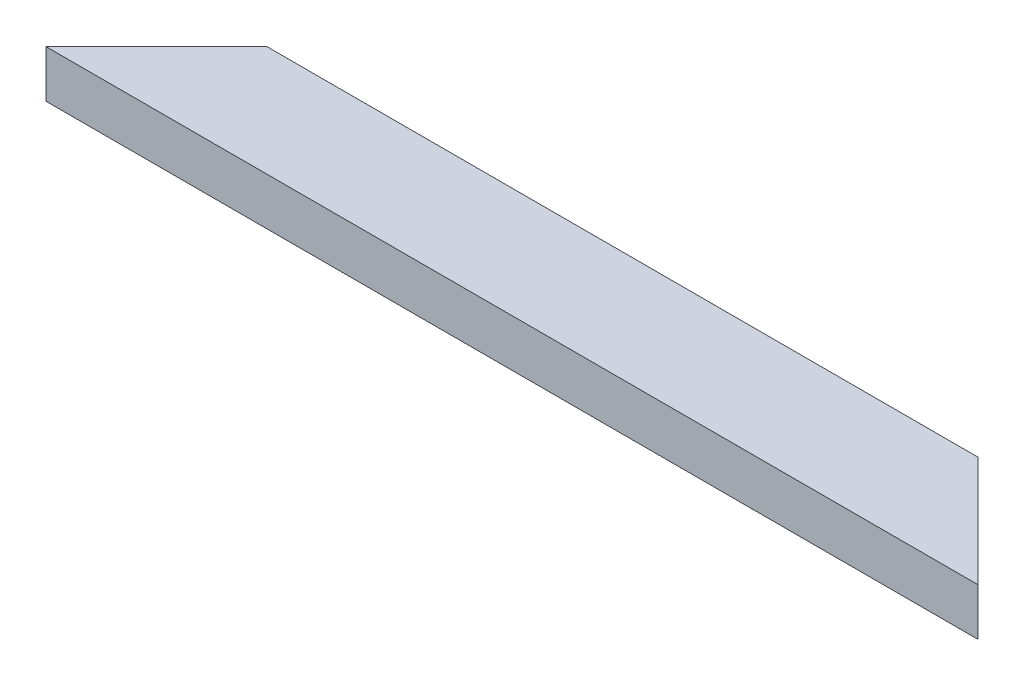
ISO-10303-21;
HEADER;
FILE_DESCRIPTION(('STEP AP214'),'2;1');
FILE_NAME('part.step','',(''),(''),'','','');
FILE_SCHEMA(('AUTOMOTIVE_DESIGN { 1 0 10303 214 1 1 1 1 }'));
ENDSEC;
DATA;
#1=APPLICATION_CONTEXT('core data for automotive mechanical design processes');
#2=APPLICATION_PROTOCOL_DEFINITION('international standard','automotive_design',2000,#1);
#3=PRODUCT_CONTEXT('',#1,'mechanical');
#4=PRODUCT('Part','Part','',(#3));
#5=PRODUCT_RELATED_PRODUCT_CATEGORY('part','',(#4));
#6=PRODUCT_DEFINITION_FORMATION('','',#4);
#7=PRODUCT_DEFINITION_CONTEXT('part definition',#1,'design');
#8=PRODUCT_DEFINITION('design','',#6,#7);
#9=PRODUCT_DEFINITION_SHAPE('','',#8);
#10=(LENGTH_UNIT() NAMED_UNIT(*) SI_UNIT(.MILLI.,.METRE.));
#11=(NAMED_UNIT(*) PLANE_ANGLE_UNIT() SI_UNIT($,.RADIAN.));
#12=(NAMED_UNIT(*) SI_UNIT($,.STERADIAN.) SOLID_ANGLE_UNIT());
#13=UNCERTAINTY_MEASURE_WITH_UNIT(LENGTH_MEASURE(1.E-05),#10,'distance_accuracy_value','');
#14=(GEOMETRIC_REPRESENTATION_CONTEXT(3) GLOBAL_UNCERTAINTY_ASSIGNED_CONTEXT((#13)) GLOBAL_UNIT_ASSIGNED_CONTEXT((#10,
#11,#12)) REPRESENTATION_CONTEXT('',''));
#15=CARTESIAN_POINT('',(0.,0.,0.));
#16=DIRECTION('',(0.,0.,1.));
#17=DIRECTION('',(1.,0.,0.));
#18=AXIS2_PLACEMENT_3D('',#15,#16,#17);
#19=CARTESIAN_POINT('',(88.8999999999999,38.1,-88.8999999999999));
#20=DIRECTION('',(0.707106781186547,0.,0.707106781186547));
#21=DIRECTION('',(0.707106781186548,0.,-0.707106781186548));
#22=AXIS2_PLACEMENT_3D('',#19,#20,#21);
#23=PLANE('',#22);
#24=DIRECTION('',(-0.707106781186547,0.,0.707106781186547));
#25=VECTOR('',#24,1.);
#26=CARTESIAN_POINT('',(88.8999999999999,0.,-88.8999999999999));
#27=LINE('',#26,#25);
#28=CARTESIAN_POINT('',(88.8999999999999,0.,-88.8999999999999));
#29=VERTEX_POINT('',#28);
#30=CARTESIAN_POINT('',(0.,0.,0.));
#31=VERTEX_POINT('',#30);
#32=EDGE_CURVE('E107',#29,#31,#27,.T.);
#33=ORIENTED_EDGE('',*,*,#32,.T.);
#34=DIRECTION('',(0.,-1.,0.));
#35=VECTOR('',#34,1.);
#36=CARTESIAN_POINT('',(0.,38.1,0.));
#37=LINE('',#36,#35);
#38=CARTESIAN_POINT('',(0.,38.1,0.));
#39=VERTEX_POINT('',#38);
#40=EDGE_CURVE('E11',#39,#31,#37,.T.);
#41=ORIENTED_EDGE('',*,*,#40,.F.);
#42=DIRECTION('',(-0.707106781186547,0.,0.707106781186547));
#43=VECTOR('',#42,1.);
#44=CARTESIAN_POINT('',(88.8999999999999,38.1,-88.8999999999999));
#45=LINE('',#44,#43);
#46=CARTESIAN_POINT('',(88.8999999999999,38.1,-88.8999999999999));
#47=VERTEX_POINT('',#46);
#48=EDGE_CURVE('E91',#47,#39,#45,.T.);
#49=ORIENTED_EDGE('',*,*,#48,.F.);
#50=DIRECTION('',(0.,-1.,0.));
#51=VECTOR('',#50,1.);
#52=CARTESIAN_POINT('',(88.8999999999999,38.1,-88.8999999999999));
#53=LINE('',#52,#51);
#54=EDGE_CURVE('E103',#47,#29,#53,.T.);
#55=ORIENTED_EDGE('',*,*,#54,.T.);
#56=EDGE_LOOP('',(#33,#41,#49,#55));
#57=FACE_BOUND('',#56,.T.);
#58=ADVANCED_FACE('F39',(#57),#23,.F.);
#59=CARTESIAN_POINT('',(0.,38.1,0.));
#60=DIRECTION('',(0.,0.,-1.));
#61=DIRECTION('',(-1.,0.,0.));
#62=AXIS2_PLACEMENT_3D('',#59,#60,#61);
#63=PLANE('',#62);
#64=DIRECTION('',(1.,0.,0.));
#65=VECTOR('',#64,1.);
#66=CARTESIAN_POINT('',(0.,0.,0.));
#67=LINE('',#66,#65);
#68=CARTESIAN_POINT('',(750.,0.,0.));
#69=VERTEX_POINT('',#68);
#70=EDGE_CURVE('E96',#31,#69,#67,.T.);
#71=ORIENTED_EDGE('',*,*,#70,.T.);
#72=DIRECTION('',(0.,-1.,0.));
#73=VECTOR('',#72,1.);
#74=CARTESIAN_POINT('',(750.,38.1,0.));
#75=LINE('',#74,#73);
#76=CARTESIAN_POINT('',(750.,38.1,0.));
#77=VERTEX_POINT('',#76);
#78=EDGE_CURVE('E48',#77,#69,#75,.T.);
#79=ORIENTED_EDGE('',*,*,#78,.F.);
#80=DIRECTION('',(1.,0.,0.));
#81=VECTOR('',#80,1.);
#82=CARTESIAN_POINT('',(0.,38.1,0.));
#83=LINE('',#82,#81);
#84=EDGE_CURVE('E86',#39,#77,#83,.T.);
#85=ORIENTED_EDGE('',*,*,#84,.F.);
#86=ORIENTED_EDGE('',*,*,#40,.T.);
#87=EDGE_LOOP('',(#71,#79,#85,#86));
#88=FACE_BOUND('',#87,.T.);
#89=ADVANCED_FACE('F95',(#88),#63,.F.);
#90=CARTESIAN_POINT('',(750.,38.1,0.));
#91=DIRECTION('',(-0.707106781186547,0.,0.707106781186548));
#92=DIRECTION('',(0.707106781186548,0.,0.707106781186547));
#93=AXIS2_PLACEMENT_3D('',#90,#91,#92);
#94=PLANE('',#93);
#95=DIRECTION('',(-0.707106781186548,0.,-0.707106781186547));
#96=VECTOR('',#95,1.);
#97=CARTESIAN_POINT('',(750.,0.,0.));
#98=LINE('',#97,#96);
#99=CARTESIAN_POINT('',(661.1,0.,-88.8999999999999));
#100=VERTEX_POINT('',#99);
#101=EDGE_CURVE('E73',#69,#100,#98,.T.);
#102=ORIENTED_EDGE('',*,*,#101,.T.);
#103=DIRECTION('',(0.,-1.,0.));
#104=VECTOR('',#103,1.);
#105=CARTESIAN_POINT('',(661.1,38.1,-88.8999999999999));
#106=LINE('',#105,#104);
#107=CARTESIAN_POINT('',(661.1,38.1,-88.8999999999999));
#108=VERTEX_POINT('',#107);
#109=EDGE_CURVE('E98',#108,#100,#106,.T.);
#110=ORIENTED_EDGE('',*,*,#109,.F.);
#111=DIRECTION('',(-0.707106781186548,0.,-0.707106781186547));
#112=VECTOR('',#111,1.);
#113=CARTESIAN_POINT('',(750.,38.1,0.));
#114=LINE('',#113,#112);
#115=EDGE_CURVE('E89',#77,#108,#114,.T.);
#116=ORIENTED_EDGE('',*,*,#115,.F.);
#117=ORIENTED_EDGE('',*,*,#78,.T.);
#118=EDGE_LOOP('',(#102,#110,#116,#117));
#119=FACE_BOUND('',#118,.T.);
#120=ADVANCED_FACE('F99',(#119),#94,.F.);
#121=CARTESIAN_POINT('',(661.1,38.1,-88.8999999999999));
#122=DIRECTION('',(0.,0.,1.));
#123=DIRECTION('',(1.,0.,0.));
#124=AXIS2_PLACEMENT_3D('',#121,#122,#123);
#125=PLANE('',#124);
#126=DIRECTION('',(-1.,0.,0.));
#127=VECTOR('',#126,1.);
#128=CARTESIAN_POINT('',(661.1,0.,-88.8999999999999));
#129=LINE('',#128,#127);
#130=EDGE_CURVE('E79',#100,#29,#129,.T.);
#131=ORIENTED_EDGE('',*,*,#130,.T.);
#132=ORIENTED_EDGE('',*,*,#54,.F.);
#133=DIRECTION('',(-1.,0.,0.));
#134=VECTOR('',#133,1.);
#135=CARTESIAN_POINT('',(661.1,38.1,-88.8999999999999));
#136=LINE('',#135,#134);
#137=EDGE_CURVE('E56',#108,#47,#136,.T.);
#138=ORIENTED_EDGE('',*,*,#137,.F.);
#139=ORIENTED_EDGE('',*,*,#109,.T.);
#140=EDGE_LOOP('',(#131,#132,#138,#139));
#141=FACE_BOUND('',#140,.T.);
#142=ADVANCED_FACE('F120',(#141),#125,.F.);
#143=CARTESIAN_POINT('',(0.,38.1,0.));
#144=DIRECTION('',(0.,-1.,0.));
#145=DIRECTION('',(0.,0.,-1.));
#146=AXIS2_PLACEMENT_3D('',#143,#144,#145);
#147=PLANE('',#146);
#148=ORIENTED_EDGE('',*,*,#48,.T.);
#149=ORIENTED_EDGE('',*,*,#84,.T.);
#150=ORIENTED_EDGE('',*,*,#115,.T.);
#151=ORIENTED_EDGE('',*,*,#137,.T.);
#152=EDGE_LOOP('',(#148,#149,#150,#151));
#153=FACE_BOUND('',#152,.T.);
#154=ADVANCED_FACE('F87',(#153),#147,.F.);
#155=CARTESIAN_POINT('',(0.,0.,0.));
#156=DIRECTION('',(0.,-1.,0.));
#157=DIRECTION('',(0.,0.,-1.));
#158=AXIS2_PLACEMENT_3D('',#155,#156,#157);
#159=PLANE('',#158);
#160=ORIENTED_EDGE('',*,*,#32,.F.);
#161=ORIENTED_EDGE('',*,*,#130,.F.);
#162=ORIENTED_EDGE('',*,*,#101,.F.);
#163=ORIENTED_EDGE('',*,*,#70,.F.);
#164=EDGE_LOOP('',(#160,#161,#162,#163));
#165=FACE_BOUND('',#164,.T.);
#166=ADVANCED_FACE('F123',(#165),#159,.T.);
#167=CLOSED_SHELL('',(#58,#89,#120,#142,#154,#166));
#168=MANIFOLD_SOLID_BREP('B2',#167);
#169=ADVANCED_BREP_SHAPE_REPRESENTATION('',(#18,#168),#14);
#170=SHAPE_DEFINITION_REPRESENTATION(#9,#169);
ENDSEC;
END-ISO-10303-21;
